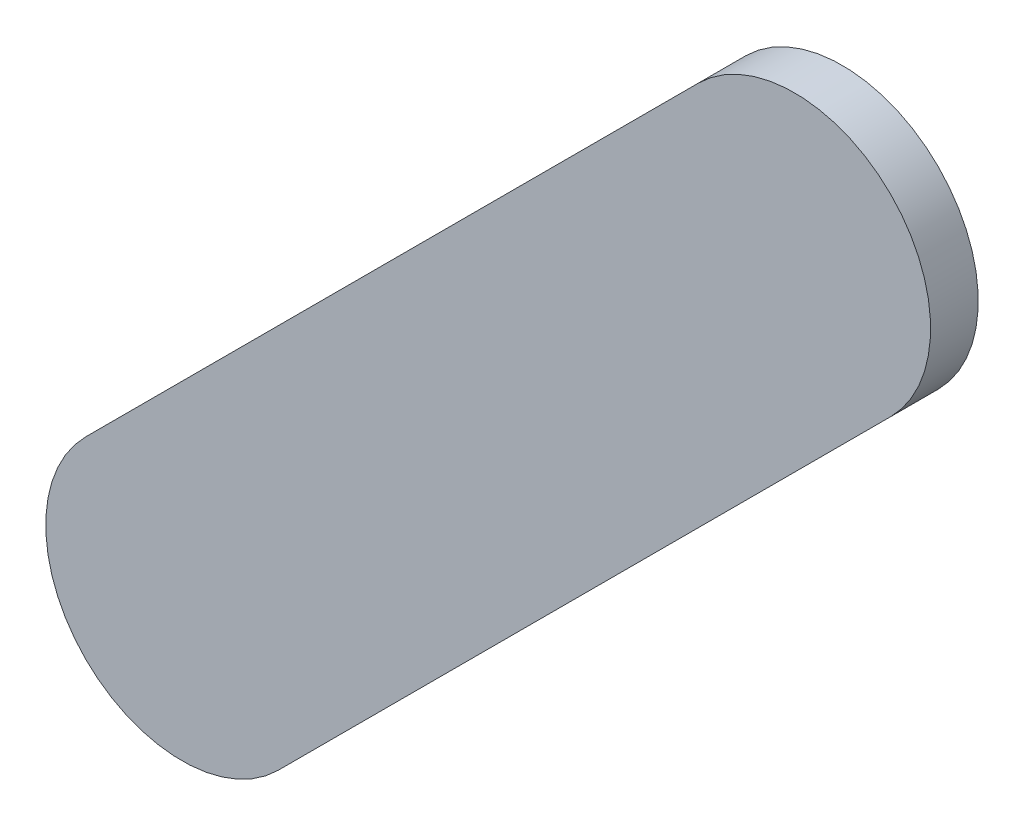
ISO-10303-21;
HEADER;
FILE_DESCRIPTION(('STEP AP214'),'2;1');
FILE_NAME('part.step','',(''),(''),'','','');
FILE_SCHEMA(('AUTOMOTIVE_DESIGN { 1 0 10303 214 1 1 1 1 }'));
ENDSEC;
DATA;
#1=APPLICATION_CONTEXT('core data for automotive mechanical design processes');
#2=APPLICATION_PROTOCOL_DEFINITION('international standard','automotive_design',2000,#1);
#3=PRODUCT_CONTEXT('',#1,'mechanical');
#4=PRODUCT('Part','Part','',(#3));
#5=PRODUCT_RELATED_PRODUCT_CATEGORY('part','',(#4));
#6=PRODUCT_DEFINITION_FORMATION('','',#4);
#7=PRODUCT_DEFINITION_CONTEXT('part definition',#1,'design');
#8=PRODUCT_DEFINITION('design','',#6,#7);
#9=PRODUCT_DEFINITION_SHAPE('','',#8);
#10=(LENGTH_UNIT() NAMED_UNIT(*) SI_UNIT(.MILLI.,.METRE.));
#11=(NAMED_UNIT(*) PLANE_ANGLE_UNIT() SI_UNIT($,.RADIAN.));
#12=(NAMED_UNIT(*) SI_UNIT($,.STERADIAN.) SOLID_ANGLE_UNIT());
#13=UNCERTAINTY_MEASURE_WITH_UNIT(LENGTH_MEASURE(1.E-05),#10,'distance_accuracy_value','');
#14=(GEOMETRIC_REPRESENTATION_CONTEXT(3) GLOBAL_UNCERTAINTY_ASSIGNED_CONTEXT((#13)) GLOBAL_UNIT_ASSIGNED_CONTEXT((#10,
#11,#12)) REPRESENTATION_CONTEXT('',''));
#15=CARTESIAN_POINT('',(0.,0.,0.));
#16=DIRECTION('',(0.,0.,1.));
#17=DIRECTION('',(1.,0.,0.));
#18=AXIS2_PLACEMENT_3D('',#15,#16,#17);
#19=CARTESIAN_POINT('',(80.029289,-117.029289,1.635));
#20=DIRECTION('',(0.,0.,1.));
#21=DIRECTION('',(1.,0.,0.));
#22=AXIS2_PLACEMENT_3D('',#19,#20,#21);
#23=PLANE('',#22);
#24=DIRECTION('',(-0.707106781186548,-0.707106781186548,0.));
#25=VECTOR('',#24,1.);
#26=CARTESIAN_POINT('',(80.029289,-117.029289,1.635));
#27=LINE('',#26,#25);
#28=CARTESIAN_POINT('',(80.029289,-117.029289,1.635));
#29=VERTEX_POINT('',#28);
#30=CARTESIAN_POINT('',(79.579289,-117.479289,1.635));
#31=VERTEX_POINT('',#30);
#32=EDGE_CURVE('E81',#29,#31,#27,.T.);
#33=ORIENTED_EDGE('',*,*,#32,.T.);
#34=CARTESIAN_POINT('',(79.6499995,-117.5499995,1.635));
#35=DIRECTION('',(0.,0.,1.));
#36=DIRECTION('',(-0.707106781186548,0.707106781186548,0.));
#37=AXIS2_PLACEMENT_3D('',#34,#35,#36);
#38=CIRCLE('',#37,0.09999974810219);
#39=CARTESIAN_POINT('',(79.72071,-117.62071,1.635));
#40=VERTEX_POINT('',#39);
#41=EDGE_CURVE('E109',#31,#40,#38,.T.);
#42=ORIENTED_EDGE('',*,*,#41,.T.);
#43=DIRECTION('',(0.707106781186548,0.707106781186548,0.));
#44=VECTOR('',#43,1.);
#45=CARTESIAN_POINT('',(79.72071,-117.62071,1.635));
#46=LINE('',#45,#44);
#47=CARTESIAN_POINT('',(80.17071,-117.17071,1.635));
#48=VERTEX_POINT('',#47);
#49=EDGE_CURVE('E74',#40,#48,#46,.T.);
#50=ORIENTED_EDGE('',*,*,#49,.T.);
#51=CARTESIAN_POINT('',(80.0999995,-117.0999995,1.635));
#52=DIRECTION('',(0.,0.,1.));
#53=DIRECTION('',(0.707106781186548,-0.707106781186548,0.));
#54=AXIS2_PLACEMENT_3D('',#51,#52,#53);
#55=CIRCLE('',#54,0.09999974810218);
#56=EDGE_CURVE('E11',#48,#29,#55,.T.);
#57=ORIENTED_EDGE('',*,*,#56,.T.);
#58=EDGE_LOOP('',(#33,#42,#50,#57));
#59=FACE_BOUND('',#58,.T.);
#60=ADVANCED_FACE('F17',(#59),#23,.T.);
#61=CARTESIAN_POINT('',(80.029289,-117.029289,1.6));
#62=DIRECTION('',(0.,0.,1.));
#63=DIRECTION('',(1.,0.,0.));
#64=AXIS2_PLACEMENT_3D('',#61,#62,#63);
#65=PLANE('',#64);
#66=CARTESIAN_POINT('',(80.0999995,-117.0999995,1.6));
#67=DIRECTION('',(0.,0.,1.));
#68=DIRECTION('',(0.707106781186548,-0.707106781186548,0.));
#69=AXIS2_PLACEMENT_3D('',#66,#67,#68);
#70=CIRCLE('',#69,0.09999974810218);
#71=CARTESIAN_POINT('',(80.17071,-117.17071,1.6));
#72=VERTEX_POINT('',#71);
#73=CARTESIAN_POINT('',(80.029289,-117.029289,1.6));
#74=VERTEX_POINT('',#73);
#75=EDGE_CURVE('E25',#72,#74,#70,.T.);
#76=ORIENTED_EDGE('',*,*,#75,.F.);
#77=DIRECTION('',(0.707106781186548,0.707106781186548,0.));
#78=VECTOR('',#77,1.);
#79=CARTESIAN_POINT('',(79.72071,-117.62071,1.6));
#80=LINE('',#79,#78);
#81=CARTESIAN_POINT('',(79.72071,-117.62071,1.6));
#82=VERTEX_POINT('',#81);
#83=EDGE_CURVE('E105',#82,#72,#80,.T.);
#84=ORIENTED_EDGE('',*,*,#83,.F.);
#85=CARTESIAN_POINT('',(79.6499995,-117.5499995,1.6));
#86=DIRECTION('',(0.,0.,1.));
#87=DIRECTION('',(-0.707106781186548,0.707106781186548,0.));
#88=AXIS2_PLACEMENT_3D('',#85,#86,#87);
#89=CIRCLE('',#88,0.09999974810219);
#90=CARTESIAN_POINT('',(79.579289,-117.479289,1.6));
#91=VERTEX_POINT('',#90);
#92=EDGE_CURVE('E83',#91,#82,#89,.T.);
#93=ORIENTED_EDGE('',*,*,#92,.F.);
#94=DIRECTION('',(-0.707106781186548,-0.707106781186548,0.));
#95=VECTOR('',#94,1.);
#96=CARTESIAN_POINT('',(80.029289,-117.029289,1.6));
#97=LINE('',#96,#95);
#98=EDGE_CURVE('E79',#74,#91,#97,.T.);
#99=ORIENTED_EDGE('',*,*,#98,.F.);
#100=EDGE_LOOP('',(#76,#84,#93,#99));
#101=FACE_BOUND('',#100,.T.);
#102=ADVANCED_FACE('F85',(#101),#65,.F.);
#103=CARTESIAN_POINT('',(80.0999995,-117.0999995,1.6));
#104=DIRECTION('',(0.,0.,-1.));
#105=DIRECTION('',(0.707106781186548,-0.707106781186548,0.));
#106=AXIS2_PLACEMENT_3D('',#103,#104,#105);
#107=CYLINDRICAL_SURFACE('',#106,0.09999974810218);
#108=ORIENTED_EDGE('',*,*,#75,.T.);
#109=DIRECTION('',(0.,0.,1.));
#110=VECTOR('',#109,1.);
#111=CARTESIAN_POINT('',(80.029289,-117.029289,1.6));
#112=LINE('',#111,#110);
#113=EDGE_CURVE('E68',#74,#29,#112,.T.);
#114=ORIENTED_EDGE('',*,*,#113,.T.);
#115=ORIENTED_EDGE('',*,*,#56,.F.);
#116=DIRECTION('',(0.,0.,1.));
#117=VECTOR('',#116,1.);
#118=CARTESIAN_POINT('',(80.17071,-117.17071,1.6));
#119=LINE('',#118,#117);
#120=EDGE_CURVE('E71',#72,#48,#119,.T.);
#121=ORIENTED_EDGE('',*,*,#120,.F.);
#122=EDGE_LOOP('',(#108,#114,#115,#121));
#123=FACE_BOUND('',#122,.T.);
#124=ADVANCED_FACE('F67',(#123),#107,.T.);
#125=CARTESIAN_POINT('',(79.72071,-117.62071,1.6));
#126=DIRECTION('',(-0.707106781186548,0.707106781186548,0.));
#127=DIRECTION('',(0.,0.,1.));
#128=AXIS2_PLACEMENT_3D('',#125,#126,#127);
#129=PLANE('',#128);
#130=ORIENTED_EDGE('',*,*,#83,.T.);
#131=ORIENTED_EDGE('',*,*,#120,.T.);
#132=ORIENTED_EDGE('',*,*,#49,.F.);
#133=DIRECTION('',(0.,0.,1.));
#134=VECTOR('',#133,1.);
#135=CARTESIAN_POINT('',(79.72071,-117.62071,1.6));
#136=LINE('',#135,#134);
#137=EDGE_CURVE('E102',#82,#40,#136,.T.);
#138=ORIENTED_EDGE('',*,*,#137,.F.);
#139=EDGE_LOOP('',(#130,#131,#132,#138));
#140=FACE_BOUND('',#139,.T.);
#141=ADVANCED_FACE('F124',(#140),#129,.F.);
#142=CARTESIAN_POINT('',(79.6499995,-117.5499995,1.6));
#143=DIRECTION('',(0.,0.,-1.));
#144=DIRECTION('',(-0.707106781186548,0.707106781186548,0.));
#145=AXIS2_PLACEMENT_3D('',#142,#143,#144);
#146=CYLINDRICAL_SURFACE('',#145,0.09999974810219);
#147=ORIENTED_EDGE('',*,*,#92,.T.);
#148=ORIENTED_EDGE('',*,*,#137,.T.);
#149=ORIENTED_EDGE('',*,*,#41,.F.);
#150=DIRECTION('',(0.,0.,1.));
#151=VECTOR('',#150,1.);
#152=CARTESIAN_POINT('',(79.579289,-117.479289,1.6));
#153=LINE('',#152,#151);
#154=EDGE_CURVE('E89',#91,#31,#153,.T.);
#155=ORIENTED_EDGE('',*,*,#154,.F.);
#156=EDGE_LOOP('',(#147,#148,#149,#155));
#157=FACE_BOUND('',#156,.T.);
#158=ADVANCED_FACE('F126',(#157),#146,.T.);
#159=CARTESIAN_POINT('',(80.029289,-117.029289,1.6));
#160=DIRECTION('',(0.707106781186548,-0.707106781186548,0.));
#161=DIRECTION('',(0.,0.,-1.));
#162=AXIS2_PLACEMENT_3D('',#159,#160,#161);
#163=PLANE('',#162);
#164=ORIENTED_EDGE('',*,*,#98,.T.);
#165=ORIENTED_EDGE('',*,*,#154,.T.);
#166=ORIENTED_EDGE('',*,*,#32,.F.);
#167=ORIENTED_EDGE('',*,*,#113,.F.);
#168=EDGE_LOOP('',(#164,#165,#166,#167));
#169=FACE_BOUND('',#168,.T.);
#170=ADVANCED_FACE('F77',(#169),#163,.F.);
#171=CLOSED_SHELL('',(#60,#102,#124,#141,#158,#170));
#172=MANIFOLD_SOLID_BREP('B1',#171);
#173=ADVANCED_BREP_SHAPE_REPRESENTATION('',(#18,#172),#14);
#174=SHAPE_DEFINITION_REPRESENTATION(#9,#173);
ENDSEC;
END-ISO-10303-21;
